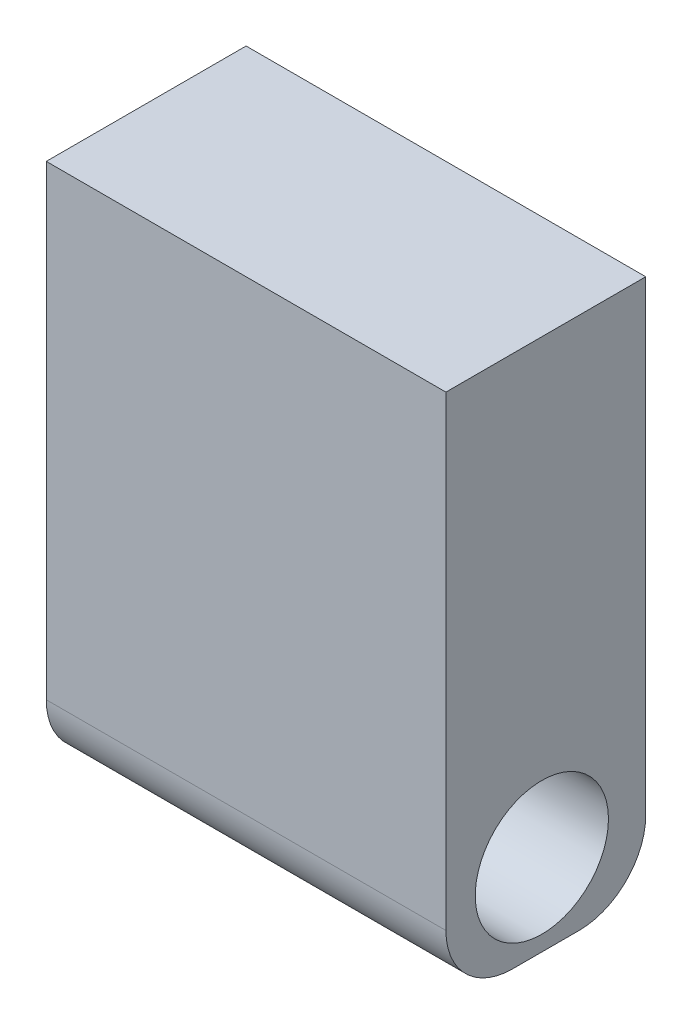
ISO-10303-21;
HEADER;
FILE_DESCRIPTION(('STEP AP214'),'2;1');
FILE_NAME('part.step','',(''),(''),'','','');
FILE_SCHEMA(('AUTOMOTIVE_DESIGN { 1 0 10303 214 1 1 1 1 }'));
ENDSEC;
DATA;
#1=APPLICATION_CONTEXT('core data for automotive mechanical design processes');
#2=APPLICATION_PROTOCOL_DEFINITION('international standard','automotive_design',2000,#1);
#3=PRODUCT_CONTEXT('',#1,'mechanical');
#4=PRODUCT('Part','Part','',(#3));
#5=PRODUCT_RELATED_PRODUCT_CATEGORY('part','',(#4));
#6=PRODUCT_DEFINITION_FORMATION('','',#4);
#7=PRODUCT_DEFINITION_CONTEXT('part definition',#1,'design');
#8=PRODUCT_DEFINITION('design','',#6,#7);
#9=PRODUCT_DEFINITION_SHAPE('','',#8);
#10=(LENGTH_UNIT() NAMED_UNIT(*) SI_UNIT(.MILLI.,.METRE.));
#11=(NAMED_UNIT(*) PLANE_ANGLE_UNIT() SI_UNIT($,.RADIAN.));
#12=(NAMED_UNIT(*) SI_UNIT($,.STERADIAN.) SOLID_ANGLE_UNIT());
#13=UNCERTAINTY_MEASURE_WITH_UNIT(LENGTH_MEASURE(1.E-05),#10,'distance_accuracy_value','');
#14=(GEOMETRIC_REPRESENTATION_CONTEXT(3) GLOBAL_UNCERTAINTY_ASSIGNED_CONTEXT((#13)) GLOBAL_UNIT_ASSIGNED_CONTEXT((#10,
#11,#12)) REPRESENTATION_CONTEXT('',''));
#15=CARTESIAN_POINT('',(0.,0.,0.));
#16=DIRECTION('',(0.,0.,1.));
#17=DIRECTION('',(1.,0.,0.));
#18=AXIS2_PLACEMENT_3D('',#15,#16,#17);
#19=CARTESIAN_POINT('',(286.793252060923,0.,15.));
#20=DIRECTION('',(-1.,0.,0.));
#21=DIRECTION('',(0.,0.,1.));
#22=AXIS2_PLACEMENT_3D('',#19,#20,#21);
#23=PLANE('',#22);
#24=CARTESIAN_POINT('',(286.793252060923,6.15401152172385,7.79855036830965));
#25=DIRECTION('',(1.,0.,0.));
#26=DIRECTION('',(0.,0.,-1.));
#27=AXIS2_PLACEMENT_3D('',#24,#25,#26);
#28=CIRCLE('',#27,5.);
#29=CARTESIAN_POINT('',(286.793252060923,6.15401152172385,2.79855036830965));
#30=VERTEX_POINT('',#29);
#31=EDGE_CURVE('E150',#30,#30,#28,.T.);
#32=ORIENTED_EDGE('',*,*,#31,.F.);
#33=EDGE_LOOP('',(#32));
#34=FACE_BOUND('',#33,.T.);
#35=DIRECTION('',(0.,0.,-1.));
#36=VECTOR('',#35,1.);
#37=CARTESIAN_POINT('',(286.793252060923,0.,15.));
#38=LINE('',#37,#36);
#39=CARTESIAN_POINT('',(286.793252060923,0.,10.));
#40=VERTEX_POINT('',#39);
#41=CARTESIAN_POINT('',(286.793252060923,0.,5.));
#42=VERTEX_POINT('',#41);
#43=EDGE_CURVE('E137',#40,#42,#38,.T.);
#44=ORIENTED_EDGE('',*,*,#43,.T.);
#45=CARTESIAN_POINT('',(286.793252060923,5.,5.));
#46=DIRECTION('',(-1.,0.,0.));
#47=DIRECTION('',(0.,0.,1.));
#48=AXIS2_PLACEMENT_3D('',#45,#46,#47);
#49=CIRCLE('',#48,5.);
#50=CARTESIAN_POINT('',(286.793252060923,5.,0.));
#51=VERTEX_POINT('',#50);
#52=EDGE_CURVE('E65',#42,#51,#49,.F.);
#53=ORIENTED_EDGE('',*,*,#52,.T.);
#54=DIRECTION('',(0.,1.,0.));
#55=VECTOR('',#54,1.);
#56=CARTESIAN_POINT('',(286.793252060923,0.,0.));
#57=LINE('',#56,#55);
#58=CARTESIAN_POINT('',(286.793252060923,40.,0.));
#59=VERTEX_POINT('',#58);
#60=EDGE_CURVE('E115',#51,#59,#57,.T.);
#61=ORIENTED_EDGE('',*,*,#60,.T.);
#62=DIRECTION('',(0.,0.,-1.));
#63=VECTOR('',#62,1.);
#64=CARTESIAN_POINT('',(286.793252060923,40.,15.));
#65=LINE('',#64,#63);
#66=CARTESIAN_POINT('',(286.793252060923,40.,15.));
#67=VERTEX_POINT('',#66);
#68=EDGE_CURVE('E109',#67,#59,#65,.T.);
#69=ORIENTED_EDGE('',*,*,#68,.F.);
#70=DIRECTION('',(0.,1.,0.));
#71=VECTOR('',#70,1.);
#72=CARTESIAN_POINT('',(286.793252060923,0.,15.));
#73=LINE('',#72,#71);
#74=CARTESIAN_POINT('',(286.793252060923,5.,15.));
#75=VERTEX_POINT('',#74);
#76=EDGE_CURVE('E95',#75,#67,#73,.T.);
#77=ORIENTED_EDGE('',*,*,#76,.F.);
#78=CARTESIAN_POINT('',(286.793252060923,5.,10.));
#79=DIRECTION('',(-1.,0.,0.));
#80=DIRECTION('',(0.,0.,1.));
#81=AXIS2_PLACEMENT_3D('',#78,#79,#80);
#82=CIRCLE('',#81,5.);
#83=EDGE_CURVE('E118',#75,#40,#82,.F.);
#84=ORIENTED_EDGE('',*,*,#83,.T.);
#85=EDGE_LOOP('',(#44,#53,#61,#69,#77,#84));
#86=FACE_BOUND('',#85,.T.);
#87=ADVANCED_FACE('F43',(#34,#86),#23,.F.);
#88=CARTESIAN_POINT('',(286.793252060923,40.,15.));
#89=DIRECTION('',(0.,-1.,0.));
#90=DIRECTION('',(1.,0.,0.));
#91=AXIS2_PLACEMENT_3D('',#88,#89,#90);
#92=PLANE('',#91);
#93=DIRECTION('',(-1.,0.,0.));
#94=VECTOR('',#93,1.);
#95=CARTESIAN_POINT('',(286.793252060923,40.,0.));
#96=LINE('',#95,#94);
#97=CARTESIAN_POINT('',(256.793252060923,40.,0.));
#98=VERTEX_POINT('',#97);
#99=EDGE_CURVE('E146',#59,#98,#96,.T.);
#100=ORIENTED_EDGE('',*,*,#99,.T.);
#101=DIRECTION('',(0.,0.,-1.));
#102=VECTOR('',#101,1.);
#103=CARTESIAN_POINT('',(256.793252060923,40.,15.));
#104=LINE('',#103,#102);
#105=CARTESIAN_POINT('',(256.793252060923,40.,15.));
#106=VERTEX_POINT('',#105);
#107=EDGE_CURVE('E111',#106,#98,#104,.T.);
#108=ORIENTED_EDGE('',*,*,#107,.F.);
#109=DIRECTION('',(-1.,0.,0.));
#110=VECTOR('',#109,1.);
#111=CARTESIAN_POINT('',(286.793252060923,40.,15.));
#112=LINE('',#111,#110);
#113=EDGE_CURVE('E99',#67,#106,#112,.T.);
#114=ORIENTED_EDGE('',*,*,#113,.F.);
#115=ORIENTED_EDGE('',*,*,#68,.T.);
#116=EDGE_LOOP('',(#100,#108,#114,#115));
#117=FACE_BOUND('',#116,.T.);
#118=ADVANCED_FACE('F108',(#117),#92,.F.);
#119=CARTESIAN_POINT('',(256.793252060923,0.,15.));
#120=DIRECTION('',(1.,0.,0.));
#121=DIRECTION('',(0.,0.,-1.));
#122=AXIS2_PLACEMENT_3D('',#119,#120,#121);
#123=PLANE('',#122);
#124=CARTESIAN_POINT('',(256.793252060923,6.15401152172385,7.79855036830965));
#125=DIRECTION('',(1.,0.,0.));
#126=DIRECTION('',(0.,0.,-1.));
#127=AXIS2_PLACEMENT_3D('',#124,#125,#126);
#128=CIRCLE('',#127,5.);
#129=CARTESIAN_POINT('',(256.793252060923,6.15401152172385,2.79855036830965));
#130=VERTEX_POINT('',#129);
#131=EDGE_CURVE('E148',#130,#130,#128,.T.);
#132=ORIENTED_EDGE('',*,*,#131,.T.);
#133=EDGE_LOOP('',(#132));
#134=FACE_BOUND('',#133,.T.);
#135=DIRECTION('',(0.,-1.,0.));
#136=VECTOR('',#135,1.);
#137=CARTESIAN_POINT('',(256.793252060923,0.,0.));
#138=LINE('',#137,#136);
#139=CARTESIAN_POINT('',(256.793252060923,5.,0.));
#140=VERTEX_POINT('',#139);
#141=EDGE_CURVE('E104',#98,#140,#138,.T.);
#142=ORIENTED_EDGE('',*,*,#141,.T.);
#143=CARTESIAN_POINT('',(256.793252060923,5.,5.));
#144=DIRECTION('',(1.,0.,0.));
#145=DIRECTION('',(0.,0.,-1.));
#146=AXIS2_PLACEMENT_3D('',#143,#144,#145);
#147=CIRCLE('',#146,5.);
#148=CARTESIAN_POINT('',(256.793252060923,0.,5.));
#149=VERTEX_POINT('',#148);
#150=EDGE_CURVE('E11',#140,#149,#147,.F.);
#151=ORIENTED_EDGE('',*,*,#150,.T.);
#152=DIRECTION('',(0.,0.,-1.));
#153=VECTOR('',#152,1.);
#154=CARTESIAN_POINT('',(256.793252060923,0.,15.));
#155=LINE('',#154,#153);
#156=CARTESIAN_POINT('',(256.793252060923,0.,10.));
#157=VERTEX_POINT('',#156);
#158=EDGE_CURVE('E120',#157,#149,#155,.T.);
#159=ORIENTED_EDGE('',*,*,#158,.F.);
#160=CARTESIAN_POINT('',(256.793252060923,5.,10.));
#161=DIRECTION('',(1.,0.,0.));
#162=DIRECTION('',(0.,0.,-1.));
#163=AXIS2_PLACEMENT_3D('',#160,#161,#162);
#164=CIRCLE('',#163,5.);
#165=CARTESIAN_POINT('',(256.793252060923,5.,15.));
#166=VERTEX_POINT('',#165);
#167=EDGE_CURVE('E127',#157,#166,#164,.F.);
#168=ORIENTED_EDGE('',*,*,#167,.T.);
#169=DIRECTION('',(0.,-1.,0.));
#170=VECTOR('',#169,1.);
#171=CARTESIAN_POINT('',(256.793252060923,0.,15.));
#172=LINE('',#171,#170);
#173=EDGE_CURVE('E113',#106,#166,#172,.T.);
#174=ORIENTED_EDGE('',*,*,#173,.F.);
#175=ORIENTED_EDGE('',*,*,#107,.T.);
#176=EDGE_LOOP('',(#142,#151,#159,#168,#174,#175));
#177=FACE_BOUND('',#176,.T.);
#178=ADVANCED_FACE('F156',(#134,#177),#123,.F.);
#179=CARTESIAN_POINT('',(286.793252060923,0.,15.));
#180=DIRECTION('',(0.,1.,0.));
#181=DIRECTION('',(-1.,0.,0.));
#182=AXIS2_PLACEMENT_3D('',#179,#180,#181);
#183=PLANE('',#182);
#184=ORIENTED_EDGE('',*,*,#158,.T.);
#185=DIRECTION('',(1.,0.,0.));
#186=VECTOR('',#185,1.);
#187=CARTESIAN_POINT('',(286.793252060923,0.,5.));
#188=LINE('',#187,#186);
#189=EDGE_CURVE('E129',#149,#42,#188,.T.);
#190=ORIENTED_EDGE('',*,*,#189,.T.);
#191=ORIENTED_EDGE('',*,*,#43,.F.);
#192=DIRECTION('',(1.,0.,0.));
#193=VECTOR('',#192,1.);
#194=CARTESIAN_POINT('',(256.793252060923,0.,10.));
#195=LINE('',#194,#193);
#196=EDGE_CURVE('E125',#40,#157,#195,.F.);
#197=ORIENTED_EDGE('',*,*,#196,.T.);
#198=EDGE_LOOP('',(#184,#190,#191,#197));
#199=FACE_BOUND('',#198,.T.);
#200=ADVANCED_FACE('F136',(#199),#183,.F.);
#201=CARTESIAN_POINT('',(0.,0.,15.));
#202=DIRECTION('',(0.,0.,1.));
#203=DIRECTION('',(1.,0.,0.));
#204=AXIS2_PLACEMENT_3D('',#201,#202,#203);
#205=PLANE('',#204);
#206=ORIENTED_EDGE('',*,*,#173,.T.);
#207=DIRECTION('',(1.,0.,0.));
#208=VECTOR('',#207,1.);
#209=CARTESIAN_POINT('',(286.793252060923,5.,15.));
#210=LINE('',#209,#208);
#211=EDGE_CURVE('E102',#166,#75,#210,.T.);
#212=ORIENTED_EDGE('',*,*,#211,.T.);
#213=ORIENTED_EDGE('',*,*,#76,.T.);
#214=ORIENTED_EDGE('',*,*,#113,.T.);
#215=EDGE_LOOP('',(#206,#212,#213,#214));
#216=FACE_BOUND('',#215,.T.);
#217=ADVANCED_FACE('F98',(#216),#205,.T.);
#218=CARTESIAN_POINT('',(0.,0.,0.));
#219=DIRECTION('',(0.,0.,1.));
#220=DIRECTION('',(1.,0.,0.));
#221=AXIS2_PLACEMENT_3D('',#218,#219,#220);
#222=PLANE('',#221);
#223=ORIENTED_EDGE('',*,*,#60,.F.);
#224=DIRECTION('',(1.,0.,0.));
#225=VECTOR('',#224,1.);
#226=CARTESIAN_POINT('',(0.,4.99999999999997,0.));
#227=LINE('',#226,#225);
#228=EDGE_CURVE('E51',#51,#140,#227,.F.);
#229=ORIENTED_EDGE('',*,*,#228,.T.);
#230=ORIENTED_EDGE('',*,*,#141,.F.);
#231=ORIENTED_EDGE('',*,*,#99,.F.);
#232=EDGE_LOOP('',(#223,#229,#230,#231));
#233=FACE_BOUND('',#232,.T.);
#234=ADVANCED_FACE('F176',(#233),#222,.F.);
#235=CARTESIAN_POINT('',(0.,4.99999999999997,10.));
#236=DIRECTION('',(-1.,0.,0.));
#237=DIRECTION('',(0.,-1.,0.));
#238=AXIS2_PLACEMENT_3D('',#235,#236,#237);
#239=CYLINDRICAL_SURFACE('',#238,5.);
#240=ORIENTED_EDGE('',*,*,#167,.F.);
#241=ORIENTED_EDGE('',*,*,#196,.F.);
#242=ORIENTED_EDGE('',*,*,#83,.F.);
#243=ORIENTED_EDGE('',*,*,#211,.F.);
#244=EDGE_LOOP('',(#240,#241,#242,#243));
#245=FACE_BOUND('',#244,.T.);
#246=ADVANCED_FACE('F174',(#245),#239,.T.);
#247=CARTESIAN_POINT('',(286.793252060923,5.,5.));
#248=DIRECTION('',(1.,0.,0.));
#249=DIRECTION('',(0.,1.,0.));
#250=AXIS2_PLACEMENT_3D('',#247,#248,#249);
#251=CYLINDRICAL_SURFACE('',#250,5.);
#252=ORIENTED_EDGE('',*,*,#150,.F.);
#253=ORIENTED_EDGE('',*,*,#228,.F.);
#254=ORIENTED_EDGE('',*,*,#52,.F.);
#255=ORIENTED_EDGE('',*,*,#189,.F.);
#256=EDGE_LOOP('',(#252,#253,#254,#255));
#257=FACE_BOUND('',#256,.T.);
#258=ADVANCED_FACE('F45',(#257),#251,.T.);
#259=CARTESIAN_POINT('',(256.793252060923,6.15401152172385,7.79855036830965));
#260=DIRECTION('',(1.,0.,0.));
#261=DIRECTION('',(0.,0.,-1.));
#262=AXIS2_PLACEMENT_3D('',#259,#260,#261);
#263=CYLINDRICAL_SURFACE('',#262,5.);
#264=ORIENTED_EDGE('',*,*,#131,.F.);
#265=EDGE_LOOP('',(#264));
#266=FACE_BOUND('',#265,.T.);
#267=ORIENTED_EDGE('',*,*,#31,.T.);
#268=EDGE_LOOP('',(#267));
#269=FACE_BOUND('',#268,.T.);
#270=ADVANCED_FACE('F159',(#266,#269),#263,.F.);
#271=CLOSED_SHELL('',(#87,#118,#178,#200,#217,#234,#246,#258,#270));
#272=MANIFOLD_SOLID_BREP('B2',#271);
#273=ADVANCED_BREP_SHAPE_REPRESENTATION('',(#18,#272),#14);
#274=SHAPE_DEFINITION_REPRESENTATION(#9,#273);
ENDSEC;
END-ISO-10303-21;
